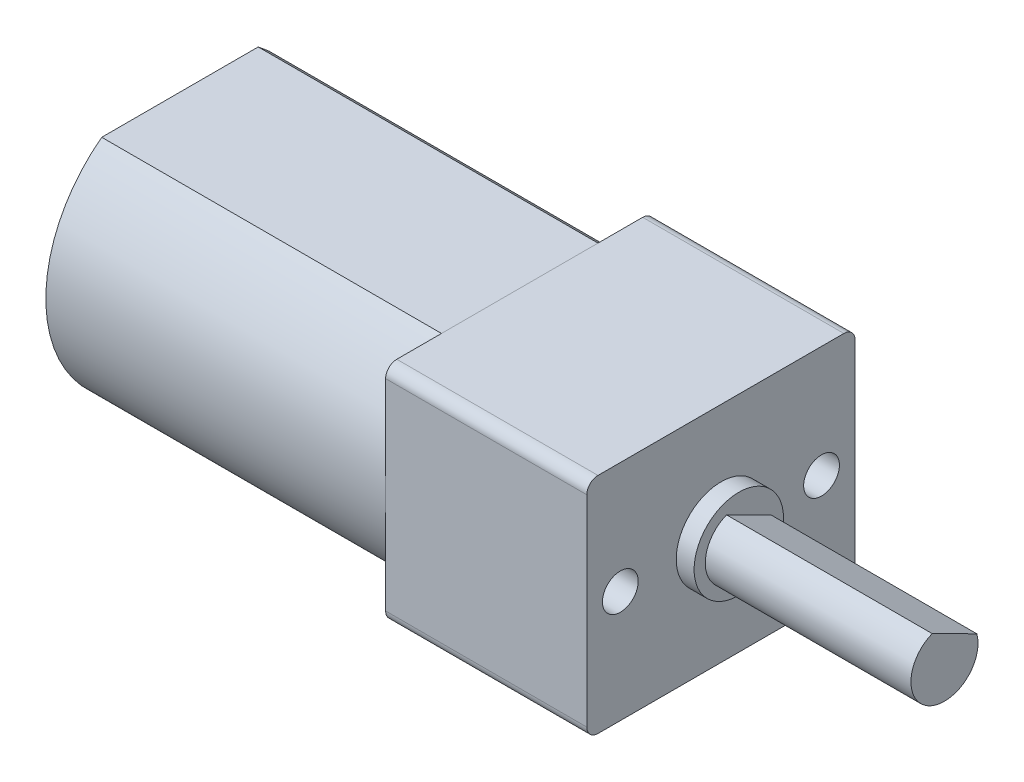
ISO-10303-21;
HEADER;
FILE_DESCRIPTION(('STEP AP214'),'2;1');
FILE_NAME('part.step','',(''),(''),'','','');
FILE_SCHEMA(('AUTOMOTIVE_DESIGN { 1 0 10303 214 1 1 1 1 }'));
ENDSEC;
DATA;
#1=APPLICATION_CONTEXT('core data for automotive mechanical design processes');
#2=APPLICATION_PROTOCOL_DEFINITION('international standard','automotive_design',2000,#1);
#3=PRODUCT_CONTEXT('',#1,'mechanical');
#4=PRODUCT('Part','Part','',(#3));
#5=PRODUCT_RELATED_PRODUCT_CATEGORY('part','',(#4));
#6=PRODUCT_DEFINITION_FORMATION('','',#4);
#7=PRODUCT_DEFINITION_CONTEXT('part definition',#1,'design');
#8=PRODUCT_DEFINITION('design','',#6,#7);
#9=PRODUCT_DEFINITION_SHAPE('','',#8);
#10=(LENGTH_UNIT() NAMED_UNIT(*) SI_UNIT(.MILLI.,.METRE.));
#11=(NAMED_UNIT(*) PLANE_ANGLE_UNIT() SI_UNIT($,.RADIAN.));
#12=(NAMED_UNIT(*) SI_UNIT($,.STERADIAN.) SOLID_ANGLE_UNIT());
#13=UNCERTAINTY_MEASURE_WITH_UNIT(LENGTH_MEASURE(1.E-05),#10,'distance_accuracy_value','');
#14=(GEOMETRIC_REPRESENTATION_CONTEXT(3) GLOBAL_UNCERTAINTY_ASSIGNED_CONTEXT((#13)) GLOBAL_UNIT_ASSIGNED_CONTEXT((#10,
#11,#12)) REPRESENTATION_CONTEXT('',''));
#15=CARTESIAN_POINT('',(0.,0.,0.));
#16=DIRECTION('',(0.,0.,1.));
#17=DIRECTION('',(1.,0.,0.));
#18=AXIS2_PLACEMENT_3D('',#15,#16,#17);
#19=CARTESIAN_POINT('',(34.2,0.893301313072371,-0.44945830069449));
#20=DIRECTION('',(0.,0.893301313072371,-0.449458300694489));
#21=DIRECTION('',(0.,0.449458300694489,0.893301313072371));
#22=AXIS2_PLACEMENT_3D('',#19,#20,#21);
#23=PLANE('',#22);
#24=DIRECTION('',(0.,-0.44945830069449,-0.893301313072371));
#25=VECTOR('',#24,1.);
#26=CARTESIAN_POINT('',(25.,0.893301313072371,-0.44945830069449));
#27=LINE('',#26,#25);
#28=CARTESIAN_POINT('',(25.,1.39581096977458,0.549282929515332));
#29=VERTEX_POINT('',#28);
#30=CARTESIAN_POINT('',(25.,0.390791656370161,-1.44819953090431));
#31=VERTEX_POINT('',#30);
#32=EDGE_CURVE('E72',#29,#31,#27,.T.);
#33=ORIENTED_EDGE('',*,*,#32,.F.);
#34=DIRECTION('',(-1.,0.,0.));
#35=VECTOR('',#34,1.);
#36=CARTESIAN_POINT('',(34.2,1.39581096977458,0.549282929515332));
#37=LINE('',#36,#35);
#38=CARTESIAN_POINT('',(34.2,1.39581096977458,0.549282929515332));
#39=VERTEX_POINT('',#38);
#40=EDGE_CURVE('E12',#39,#29,#37,.T.);
#41=ORIENTED_EDGE('',*,*,#40,.F.);
#42=DIRECTION('',(0.,-0.44945830069449,-0.893301313072371));
#43=VECTOR('',#42,1.);
#44=CARTESIAN_POINT('',(34.2,0.893301313072371,-0.44945830069449));
#45=LINE('',#44,#43);
#46=CARTESIAN_POINT('',(34.2,0.390791656370161,-1.44819953090431));
#47=VERTEX_POINT('',#46);
#48=EDGE_CURVE('E73',#39,#47,#45,.T.);
#49=ORIENTED_EDGE('',*,*,#48,.T.);
#50=DIRECTION('',(-1.,0.,0.));
#51=VECTOR('',#50,1.);
#52=CARTESIAN_POINT('',(34.2,0.390791656370161,-1.44819953090431));
#53=LINE('',#52,#51);
#54=EDGE_CURVE('E52',#47,#31,#53,.T.);
#55=ORIENTED_EDGE('',*,*,#54,.T.);
#56=EDGE_LOOP('',(#33,#41,#49,#55));
#57=FACE_BOUND('',#56,.T.);
#58=ADVANCED_FACE('F44',(#57),#23,.T.);
#59=CARTESIAN_POINT('',(34.2,0.,0.));
#60=DIRECTION('',(-1.,0.,0.));
#61=DIRECTION('',(0.,0.,1.));
#62=AXIS2_PLACEMENT_3D('',#59,#60,#61);
#63=CYLINDRICAL_SURFACE('',#62,1.5);
#64=CARTESIAN_POINT('',(25.,0.,0.));
#65=DIRECTION('',(1.,0.,0.));
#66=DIRECTION('',(0.,0.,-1.));
#67=AXIS2_PLACEMENT_3D('',#64,#65,#66);
#68=CIRCLE('',#67,1.5);
#69=EDGE_CURVE('E74',#29,#31,#68,.T.);
#70=ORIENTED_EDGE('',*,*,#69,.T.);
#71=ORIENTED_EDGE('',*,*,#54,.F.);
#72=CARTESIAN_POINT('',(34.2,0.,0.));
#73=DIRECTION('',(1.,0.,0.));
#74=DIRECTION('',(0.,0.,-1.));
#75=AXIS2_PLACEMENT_3D('',#72,#73,#74);
#76=CIRCLE('',#75,1.5);
#77=EDGE_CURVE('E59',#39,#47,#76,.T.);
#78=ORIENTED_EDGE('',*,*,#77,.F.);
#79=ORIENTED_EDGE('',*,*,#40,.T.);
#80=EDGE_LOOP('',(#70,#71,#78,#79));
#81=FACE_BOUND('',#80,.T.);
#82=ADVANCED_FACE('F75',(#81),#63,.T.);
#83=CARTESIAN_POINT('',(34.2,0.,0.));
#84=DIRECTION('',(1.,0.,0.));
#85=DIRECTION('',(0.,0.,-1.));
#86=AXIS2_PLACEMENT_3D('',#83,#84,#85);
#87=PLANE('',#86);
#88=ORIENTED_EDGE('',*,*,#48,.F.);
#89=ORIENTED_EDGE('',*,*,#77,.T.);
#90=EDGE_LOOP('',(#88,#89));
#91=FACE_BOUND('',#90,.T.);
#92=ADVANCED_FACE('F83',(#91),#87,.T.);
#93=CARTESIAN_POINT('',(25.,0.,0.));
#94=DIRECTION('',(1.,0.,0.));
#95=DIRECTION('',(0.,0.,-1.));
#96=AXIS2_PLACEMENT_3D('',#93,#94,#95);
#97=PLANE('',#96);
#98=ORIENTED_EDGE('',*,*,#32,.T.);
#99=ORIENTED_EDGE('',*,*,#69,.F.);
#100=EDGE_LOOP('',(#98,#99));
#101=FACE_BOUND('',#100,.T.);
#102=ADVANCED_FACE('F78',(#101),#97,.F.);
#103=CLOSED_SHELL('',(#58,#82,#92,#102));
#104=MANIFOLD_SOLID_BREP('B2',#103);
#105=CARTESIAN_POINT('',(24.2,-4.5,5.5));
#106=DIRECTION('',(1.,0.,0.));
#107=DIRECTION('',(0.,0.,-1.));
#108=AXIS2_PLACEMENT_3D('',#105,#106,#107);
#109=PLANE('',#108);
#110=CARTESIAN_POINT('',(24.2,0.,4.5));
#111=DIRECTION('',(1.,0.,0.));
#112=DIRECTION('',(0.,0.,-1.));
#113=AXIS2_PLACEMENT_3D('',#110,#111,#112);
#114=CIRCLE('',#113,0.8);
#115=CARTESIAN_POINT('',(24.2,0.,3.7));
#116=VERTEX_POINT('',#115);
#117=EDGE_CURVE('E282',#116,#116,#114,.T.);
#118=ORIENTED_EDGE('',*,*,#117,.F.);
#119=EDGE_LOOP('',(#118));
#120=FACE_BOUND('',#119,.T.);
#121=CARTESIAN_POINT('',(24.2,0.,-4.5));
#122=DIRECTION('',(1.,0.,0.));
#123=DIRECTION('',(0.,0.,-1.));
#124=AXIS2_PLACEMENT_3D('',#121,#122,#123);
#125=CIRCLE('',#124,0.8);
#126=CARTESIAN_POINT('',(24.2,0.,-5.3));
#127=VERTEX_POINT('',#126);
#128=EDGE_CURVE('E276',#127,#127,#125,.T.);
#129=ORIENTED_EDGE('',*,*,#128,.F.);
#130=EDGE_LOOP('',(#129));
#131=FACE_BOUND('',#130,.T.);
#132=CARTESIAN_POINT('',(24.2,-4.5,5.5));
#133=DIRECTION('',(1.,0.,0.));
#134=DIRECTION('',(0.,0.,-1.));
#135=AXIS2_PLACEMENT_3D('',#132,#133,#134);
#136=CIRCLE('',#135,0.5);
#137=CARTESIAN_POINT('',(24.2,-4.5,6.));
#138=VERTEX_POINT('',#137);
#139=CARTESIAN_POINT('',(24.2,-5.,5.5));
#140=VERTEX_POINT('',#139);
#141=EDGE_CURVE('E237',#138,#140,#136,.T.);
#142=ORIENTED_EDGE('',*,*,#141,.T.);
#143=DIRECTION('',(0.,0.,-1.));
#144=VECTOR('',#143,1.);
#145=CARTESIAN_POINT('',(24.2,-5.,5.5));
#146=LINE('',#145,#144);
#147=CARTESIAN_POINT('',(24.2,-5.,-5.49999999999999));
#148=VERTEX_POINT('',#147);
#149=EDGE_CURVE('E185',#140,#148,#146,.T.);
#150=ORIENTED_EDGE('',*,*,#149,.T.);
#151=CARTESIAN_POINT('',(24.2,-4.5,-5.5));
#152=DIRECTION('',(1.,0.,0.));
#153=DIRECTION('',(0.,0.,-1.));
#154=AXIS2_PLACEMENT_3D('',#151,#152,#153);
#155=CIRCLE('',#154,0.5);
#156=CARTESIAN_POINT('',(24.2,-4.5,-6.));
#157=VERTEX_POINT('',#156);
#158=EDGE_CURVE('E252',#148,#157,#155,.T.);
#159=ORIENTED_EDGE('',*,*,#158,.T.);
#160=DIRECTION('',(0.,1.,0.));
#161=VECTOR('',#160,1.);
#162=CARTESIAN_POINT('',(24.2,4.5,-6.));
#163=LINE('',#162,#161);
#164=CARTESIAN_POINT('',(24.2,4.5,-6.));
#165=VERTEX_POINT('',#164);
#166=EDGE_CURVE('E264',#157,#165,#163,.T.);
#167=ORIENTED_EDGE('',*,*,#166,.T.);
#168=CARTESIAN_POINT('',(24.2,4.5,-5.5));
#169=DIRECTION('',(1.,0.,0.));
#170=DIRECTION('',(0.,0.,1.));
#171=AXIS2_PLACEMENT_3D('',#168,#169,#170);
#172=CIRCLE('',#171,0.5);
#173=CARTESIAN_POINT('',(24.2,5.,-5.49999999999999));
#174=VERTEX_POINT('',#173);
#175=EDGE_CURVE('E204',#165,#174,#172,.T.);
#176=ORIENTED_EDGE('',*,*,#175,.T.);
#177=DIRECTION('',(0.,0.,1.));
#178=VECTOR('',#177,1.);
#179=CARTESIAN_POINT('',(24.2,5.,5.5));
#180=LINE('',#179,#178);
#181=CARTESIAN_POINT('',(24.2,5.,5.5));
#182=VERTEX_POINT('',#181);
#183=EDGE_CURVE('E198',#174,#182,#180,.T.);
#184=ORIENTED_EDGE('',*,*,#183,.T.);
#185=CARTESIAN_POINT('',(24.2,4.5,5.5));
#186=DIRECTION('',(1.,0.,0.));
#187=DIRECTION('',(0.,0.,-1.));
#188=AXIS2_PLACEMENT_3D('',#185,#186,#187);
#189=CIRCLE('',#188,0.5);
#190=CARTESIAN_POINT('',(24.2,4.5,6.));
#191=VERTEX_POINT('',#190);
#192=EDGE_CURVE('E202',#182,#191,#189,.T.);
#193=ORIENTED_EDGE('',*,*,#192,.T.);
#194=DIRECTION('',(0.,-1.,0.));
#195=VECTOR('',#194,1.);
#196=CARTESIAN_POINT('',(24.2,4.5,6.));
#197=LINE('',#196,#195);
#198=EDGE_CURVE('E142',#191,#138,#197,.T.);
#199=ORIENTED_EDGE('',*,*,#198,.T.);
#200=EDGE_LOOP('',(#142,#150,#159,#167,#176,#184,#193,#199));
#201=FACE_BOUND('',#200,.T.);
#202=CARTESIAN_POINT('',(24.2,0.,0.));
#203=DIRECTION('',(1.,0.,0.));
#204=DIRECTION('',(0.,0.,-1.));
#205=AXIS2_PLACEMENT_3D('',#202,#203,#204);
#206=CIRCLE('',#205,2.);
#207=CARTESIAN_POINT('',(24.2,0.,-2.));
#208=VERTEX_POINT('',#207);
#209=EDGE_CURVE('E270',#208,#208,#206,.T.);
#210=ORIENTED_EDGE('',*,*,#209,.F.);
#211=EDGE_LOOP('',(#210));
#212=FACE_BOUND('',#211,.T.);
#213=ADVANCED_FACE('F125',(#120,#131,#201,#212),#109,.T.);
#214=CARTESIAN_POINT('',(24.2,-4.5,5.5));
#215=DIRECTION('',(-1.,0.,0.));
#216=DIRECTION('',(0.,0.,1.));
#217=AXIS2_PLACEMENT_3D('',#214,#215,#216);
#218=CYLINDRICAL_SURFACE('',#217,0.5);
#219=CARTESIAN_POINT('',(15.2,-4.5,5.5));
#220=DIRECTION('',(1.,0.,0.));
#221=DIRECTION('',(0.,0.,-1.));
#222=AXIS2_PLACEMENT_3D('',#219,#220,#221);
#223=CIRCLE('',#222,0.5);
#224=CARTESIAN_POINT('',(15.2,-4.5,6.));
#225=VERTEX_POINT('',#224);
#226=CARTESIAN_POINT('',(15.2,-5.,5.5));
#227=VERTEX_POINT('',#226);
#228=EDGE_CURVE('E222',#225,#227,#223,.T.);
#229=ORIENTED_EDGE('',*,*,#228,.T.);
#230=DIRECTION('',(-1.,0.,0.));
#231=VECTOR('',#230,1.);
#232=CARTESIAN_POINT('',(24.2,-5.,5.5));
#233=LINE('',#232,#231);
#234=EDGE_CURVE('E42',#140,#227,#233,.T.);
#235=ORIENTED_EDGE('',*,*,#234,.F.);
#236=ORIENTED_EDGE('',*,*,#141,.F.);
#237=DIRECTION('',(-1.,0.,0.));
#238=VECTOR('',#237,1.);
#239=CARTESIAN_POINT('',(24.2,-4.5,6.));
#240=LINE('',#239,#238);
#241=EDGE_CURVE('E218',#138,#225,#240,.T.);
#242=ORIENTED_EDGE('',*,*,#241,.T.);
#243=EDGE_LOOP('',(#229,#235,#236,#242));
#244=FACE_BOUND('',#243,.T.);
#245=ADVANCED_FACE('F127',(#244),#218,.T.);
#246=CARTESIAN_POINT('',(24.2,-5.,5.5));
#247=DIRECTION('',(0.,1.,0.));
#248=DIRECTION('',(0.,0.,1.));
#249=AXIS2_PLACEMENT_3D('',#246,#247,#248);
#250=PLANE('',#249);
#251=DIRECTION('',(0.,0.,-1.));
#252=VECTOR('',#251,1.);
#253=CARTESIAN_POINT('',(15.2,-5.,5.5));
#254=LINE('',#253,#252);
#255=CARTESIAN_POINT('',(15.2,-5.,-5.49999999999999));
#256=VERTEX_POINT('',#255);
#257=EDGE_CURVE('E225',#227,#256,#254,.T.);
#258=ORIENTED_EDGE('',*,*,#257,.T.);
#259=DIRECTION('',(-1.,0.,0.));
#260=VECTOR('',#259,1.);
#261=CARTESIAN_POINT('',(24.2,-5.,-5.49999999999999));
#262=LINE('',#261,#260);
#263=EDGE_CURVE('E134',#148,#256,#262,.T.);
#264=ORIENTED_EDGE('',*,*,#263,.F.);
#265=ORIENTED_EDGE('',*,*,#149,.F.);
#266=ORIENTED_EDGE('',*,*,#234,.T.);
#267=EDGE_LOOP('',(#258,#264,#265,#266));
#268=FACE_BOUND('',#267,.T.);
#269=ADVANCED_FACE('F335',(#268),#250,.F.);
#270=CARTESIAN_POINT('',(24.2,-4.5,-5.5));
#271=DIRECTION('',(-1.,0.,0.));
#272=DIRECTION('',(0.,0.,1.));
#273=AXIS2_PLACEMENT_3D('',#270,#271,#272);
#274=CYLINDRICAL_SURFACE('',#273,0.5);
#275=CARTESIAN_POINT('',(15.2,-4.5,-5.5));
#276=DIRECTION('',(1.,0.,0.));
#277=DIRECTION('',(0.,0.,-1.));
#278=AXIS2_PLACEMENT_3D('',#275,#276,#277);
#279=CIRCLE('',#278,0.5);
#280=CARTESIAN_POINT('',(15.2,-4.5,-6.));
#281=VERTEX_POINT('',#280);
#282=EDGE_CURVE('E228',#256,#281,#279,.T.);
#283=ORIENTED_EDGE('',*,*,#282,.T.);
#284=DIRECTION('',(-1.,0.,0.));
#285=VECTOR('',#284,1.);
#286=CARTESIAN_POINT('',(24.2,-4.5,-6.));
#287=LINE('',#286,#285);
#288=EDGE_CURVE('E244',#157,#281,#287,.T.);
#289=ORIENTED_EDGE('',*,*,#288,.F.);
#290=ORIENTED_EDGE('',*,*,#158,.F.);
#291=ORIENTED_EDGE('',*,*,#263,.T.);
#292=EDGE_LOOP('',(#283,#289,#290,#291));
#293=FACE_BOUND('',#292,.T.);
#294=ADVANCED_FACE('F250',(#293),#274,.T.);
#295=CARTESIAN_POINT('',(24.2,4.5,-6.));
#296=DIRECTION('',(0.,0.,1.));
#297=DIRECTION('',(0.,-1.,0.));
#298=AXIS2_PLACEMENT_3D('',#295,#296,#297);
#299=PLANE('',#298);
#300=DIRECTION('',(0.,1.,0.));
#301=VECTOR('',#300,1.);
#302=CARTESIAN_POINT('',(15.2,4.5,-6.));
#303=LINE('',#302,#301);
#304=CARTESIAN_POINT('',(15.2,4.5,-6.));
#305=VERTEX_POINT('',#304);
#306=EDGE_CURVE('E230',#281,#305,#303,.T.);
#307=ORIENTED_EDGE('',*,*,#306,.T.);
#308=DIRECTION('',(-1.,0.,0.));
#309=VECTOR('',#308,1.);
#310=CARTESIAN_POINT('',(24.2,4.5,-6.));
#311=LINE('',#310,#309);
#312=EDGE_CURVE('E241',#165,#305,#311,.T.);
#313=ORIENTED_EDGE('',*,*,#312,.F.);
#314=ORIENTED_EDGE('',*,*,#166,.F.);
#315=ORIENTED_EDGE('',*,*,#288,.T.);
#316=EDGE_LOOP('',(#307,#313,#314,#315));
#317=FACE_BOUND('',#316,.T.);
#318=ADVANCED_FACE('F260',(#317),#299,.F.);
#319=CARTESIAN_POINT('',(24.2,4.5,-5.5));
#320=DIRECTION('',(-1.,0.,0.));
#321=DIRECTION('',(0.,0.,1.));
#322=AXIS2_PLACEMENT_3D('',#319,#320,#321);
#323=CYLINDRICAL_SURFACE('',#322,0.5);
#324=CARTESIAN_POINT('',(15.2,4.5,-5.5));
#325=DIRECTION('',(1.,0.,0.));
#326=DIRECTION('',(0.,0.,1.));
#327=AXIS2_PLACEMENT_3D('',#324,#325,#326);
#328=CIRCLE('',#327,0.5);
#329=CARTESIAN_POINT('',(15.2,5.,-5.49999999999999));
#330=VERTEX_POINT('',#329);
#331=EDGE_CURVE('E232',#305,#330,#328,.T.);
#332=ORIENTED_EDGE('',*,*,#331,.T.);
#333=DIRECTION('',(-1.,0.,0.));
#334=VECTOR('',#333,1.);
#335=CARTESIAN_POINT('',(24.2,5.,-5.49999999999999));
#336=LINE('',#335,#334);
#337=EDGE_CURVE('E213',#174,#330,#336,.T.);
#338=ORIENTED_EDGE('',*,*,#337,.F.);
#339=ORIENTED_EDGE('',*,*,#175,.F.);
#340=ORIENTED_EDGE('',*,*,#312,.T.);
#341=EDGE_LOOP('',(#332,#338,#339,#340));
#342=FACE_BOUND('',#341,.T.);
#343=ADVANCED_FACE('F263',(#342),#323,.T.);
#344=CARTESIAN_POINT('',(24.2,5.,5.5));
#345=DIRECTION('',(0.,-1.,0.));
#346=DIRECTION('',(0.,0.,-1.));
#347=AXIS2_PLACEMENT_3D('',#344,#345,#346);
#348=PLANE('',#347);
#349=DIRECTION('',(0.,0.,1.));
#350=VECTOR('',#349,1.);
#351=CARTESIAN_POINT('',(15.2,5.,5.5));
#352=LINE('',#351,#350);
#353=CARTESIAN_POINT('',(15.2,5.,5.5));
#354=VERTEX_POINT('',#353);
#355=EDGE_CURVE('E212',#330,#354,#352,.T.);
#356=ORIENTED_EDGE('',*,*,#355,.T.);
#357=DIRECTION('',(-1.,0.,0.));
#358=VECTOR('',#357,1.);
#359=CARTESIAN_POINT('',(24.2,5.,5.5));
#360=LINE('',#359,#358);
#361=EDGE_CURVE('E209',#182,#354,#360,.T.);
#362=ORIENTED_EDGE('',*,*,#361,.F.);
#363=ORIENTED_EDGE('',*,*,#183,.F.);
#364=ORIENTED_EDGE('',*,*,#337,.T.);
#365=EDGE_LOOP('',(#356,#362,#363,#364));
#366=FACE_BOUND('',#365,.T.);
#367=ADVANCED_FACE('F210',(#366),#348,.F.);
#368=CARTESIAN_POINT('',(24.2,4.5,5.5));
#369=DIRECTION('',(-1.,0.,0.));
#370=DIRECTION('',(0.,0.,1.));
#371=AXIS2_PLACEMENT_3D('',#368,#369,#370);
#372=CYLINDRICAL_SURFACE('',#371,0.5);
#373=CARTESIAN_POINT('',(15.2,4.5,5.5));
#374=DIRECTION('',(1.,0.,0.));
#375=DIRECTION('',(0.,0.,-1.));
#376=AXIS2_PLACEMENT_3D('',#373,#374,#375);
#377=CIRCLE('',#376,0.5);
#378=CARTESIAN_POINT('',(15.2,4.5,6.));
#379=VERTEX_POINT('',#378);
#380=EDGE_CURVE('E171',#354,#379,#377,.T.);
#381=ORIENTED_EDGE('',*,*,#380,.T.);
#382=DIRECTION('',(-1.,0.,0.));
#383=VECTOR('',#382,1.);
#384=CARTESIAN_POINT('',(24.2,4.5,6.));
#385=LINE('',#384,#383);
#386=EDGE_CURVE('E214',#191,#379,#385,.T.);
#387=ORIENTED_EDGE('',*,*,#386,.F.);
#388=ORIENTED_EDGE('',*,*,#192,.F.);
#389=ORIENTED_EDGE('',*,*,#361,.T.);
#390=EDGE_LOOP('',(#381,#387,#388,#389));
#391=FACE_BOUND('',#390,.T.);
#392=ADVANCED_FACE('F216',(#391),#372,.T.);
#393=CARTESIAN_POINT('',(24.2,4.5,6.));
#394=DIRECTION('',(0.,0.,-1.));
#395=DIRECTION('',(0.,1.,0.));
#396=AXIS2_PLACEMENT_3D('',#393,#394,#395);
#397=PLANE('',#396);
#398=DIRECTION('',(0.,-1.,0.));
#399=VECTOR('',#398,1.);
#400=CARTESIAN_POINT('',(15.2,4.5,6.));
#401=LINE('',#400,#399);
#402=EDGE_CURVE('E177',#379,#225,#401,.T.);
#403=ORIENTED_EDGE('',*,*,#402,.T.);
#404=ORIENTED_EDGE('',*,*,#241,.F.);
#405=ORIENTED_EDGE('',*,*,#198,.F.);
#406=ORIENTED_EDGE('',*,*,#386,.T.);
#407=EDGE_LOOP('',(#403,#404,#405,#406));
#408=FACE_BOUND('',#407,.T.);
#409=ADVANCED_FACE('F323',(#408),#397,.F.);
#410=CARTESIAN_POINT('',(15.2,-4.5,5.5));
#411=DIRECTION('',(1.,0.,0.));
#412=DIRECTION('',(0.,0.,-1.));
#413=AXIS2_PLACEMENT_3D('',#410,#411,#412);
#414=PLANE('',#413);
#415=ORIENTED_EDGE('',*,*,#228,.F.);
#416=ORIENTED_EDGE('',*,*,#402,.F.);
#417=ORIENTED_EDGE('',*,*,#380,.F.);
#418=ORIENTED_EDGE('',*,*,#355,.F.);
#419=ORIENTED_EDGE('',*,*,#331,.F.);
#420=ORIENTED_EDGE('',*,*,#306,.F.);
#421=ORIENTED_EDGE('',*,*,#282,.F.);
#422=ORIENTED_EDGE('',*,*,#257,.F.);
#423=EDGE_LOOP('',(#415,#416,#417,#418,#419,#420,#421,#422));
#424=FACE_BOUND('',#423,.T.);
#425=ADVANCED_FACE('F256',(#424),#414,.F.);
#426=CARTESIAN_POINT('',(25.,0.,0.));
#427=DIRECTION('',(-1.,0.,0.));
#428=DIRECTION('',(0.,0.,1.));
#429=AXIS2_PLACEMENT_3D('',#426,#427,#428);
#430=CYLINDRICAL_SURFACE('',#429,2.);
#431=CARTESIAN_POINT('',(25.,0.,0.));
#432=DIRECTION('',(1.,0.,0.));
#433=DIRECTION('',(0.,0.,-1.));
#434=AXIS2_PLACEMENT_3D('',#431,#432,#433);
#435=CIRCLE('',#434,2.);
#436=CARTESIAN_POINT('',(25.,0.,-2.));
#437=VERTEX_POINT('',#436);
#438=EDGE_CURVE('E226',#437,#437,#435,.T.);
#439=ORIENTED_EDGE('',*,*,#438,.F.);
#440=EDGE_LOOP('',(#439));
#441=FACE_BOUND('',#440,.T.);
#442=ORIENTED_EDGE('',*,*,#209,.T.);
#443=EDGE_LOOP('',(#442));
#444=FACE_BOUND('',#443,.T.);
#445=ADVANCED_FACE('F313',(#441,#444),#430,.T.);
#446=CARTESIAN_POINT('',(25.,0.,0.));
#447=DIRECTION('',(1.,0.,0.));
#448=DIRECTION('',(0.,0.,-1.));
#449=AXIS2_PLACEMENT_3D('',#446,#447,#448);
#450=PLANE('',#449);
#451=ORIENTED_EDGE('',*,*,#438,.T.);
#452=EDGE_LOOP('',(#451));
#453=FACE_BOUND('',#452,.T.);
#454=ADVANCED_FACE('F304',(#453),#450,.T.);
#455=CARTESIAN_POINT('',(22.2,0.,-4.5));
#456=DIRECTION('',(1.,0.,0.));
#457=DIRECTION('',(0.,0.,-1.));
#458=AXIS2_PLACEMENT_3D('',#455,#456,#457);
#459=CYLINDRICAL_SURFACE('',#458,0.8);
#460=CARTESIAN_POINT('',(22.2,0.,-4.5));
#461=DIRECTION('',(1.,0.,0.));
#462=DIRECTION('',(0.,0.,-1.));
#463=AXIS2_PLACEMENT_3D('',#460,#461,#462);
#464=CIRCLE('',#463,0.8);
#465=CARTESIAN_POINT('',(22.2,0.,-5.3));
#466=VERTEX_POINT('',#465);
#467=EDGE_CURVE('E273',#466,#466,#464,.T.);
#468=ORIENTED_EDGE('',*,*,#467,.F.);
#469=EDGE_LOOP('',(#468));
#470=FACE_BOUND('',#469,.T.);
#471=ORIENTED_EDGE('',*,*,#128,.T.);
#472=EDGE_LOOP('',(#471));
#473=FACE_BOUND('',#472,.T.);
#474=ADVANCED_FACE('F302',(#470,#473),#459,.F.);
#475=CARTESIAN_POINT('',(22.2,0.,-4.5));
#476=DIRECTION('',(1.,0.,0.));
#477=DIRECTION('',(0.,0.,-1.));
#478=AXIS2_PLACEMENT_3D('',#475,#476,#477);
#479=PLANE('',#478);
#480=ORIENTED_EDGE('',*,*,#467,.T.);
#481=EDGE_LOOP('',(#480));
#482=FACE_BOUND('',#481,.T.);
#483=ADVANCED_FACE('F293',(#482),#479,.T.);
#484=CARTESIAN_POINT('',(22.2,0.,4.5));
#485=DIRECTION('',(1.,0.,0.));
#486=DIRECTION('',(0.,0.,-1.));
#487=AXIS2_PLACEMENT_3D('',#484,#485,#486);
#488=CYLINDRICAL_SURFACE('',#487,0.8);
#489=CARTESIAN_POINT('',(22.2,0.,4.5));
#490=DIRECTION('',(1.,0.,0.));
#491=DIRECTION('',(0.,0.,-1.));
#492=AXIS2_PLACEMENT_3D('',#489,#490,#491);
#493=CIRCLE('',#492,0.8);
#494=CARTESIAN_POINT('',(22.2,0.,3.7));
#495=VERTEX_POINT('',#494);
#496=EDGE_CURVE('E279',#495,#495,#493,.T.);
#497=ORIENTED_EDGE('',*,*,#496,.F.);
#498=EDGE_LOOP('',(#497));
#499=FACE_BOUND('',#498,.T.);
#500=ORIENTED_EDGE('',*,*,#117,.T.);
#501=EDGE_LOOP('',(#500));
#502=FACE_BOUND('',#501,.T.);
#503=ADVANCED_FACE('F290',(#499,#502),#488,.F.);
#504=CARTESIAN_POINT('',(22.2,0.,4.5));
#505=DIRECTION('',(1.,0.,0.));
#506=DIRECTION('',(0.,0.,-1.));
#507=AXIS2_PLACEMENT_3D('',#504,#505,#506);
#508=PLANE('',#507);
#509=ORIENTED_EDGE('',*,*,#496,.T.);
#510=EDGE_LOOP('',(#509));
#511=FACE_BOUND('',#510,.T.);
#512=ADVANCED_FACE('F288',(#511),#508,.T.);
#513=CLOSED_SHELL('',(#213,#245,#269,#294,#318,#343,#367,#392,#409,#425,#445,#454,#474,#483,
#503,#512));
#514=MANIFOLD_SOLID_BREP('B6',#513);
#515=CARTESIAN_POINT('',(15.2,0.,-0.250000000000001));
#516=DIRECTION('',(-1.,0.,0.));
#517=DIRECTION('',(0.,0.,1.));
#518=AXIS2_PLACEMENT_3D('',#515,#516,#517);
#519=CYLINDRICAL_SURFACE('',#518,6.25);
#520=CARTESIAN_POINT('',(0.,0.,-0.250000000000001));
#521=DIRECTION('',(1.,0.,0.));
#522=DIRECTION('',(0.,0.,-1.));
#523=AXIS2_PLACEMENT_3D('',#520,#521,#522);
#524=CIRCLE('',#523,6.25);
#525=CARTESIAN_POINT('',(0.,5.,3.5));
#526=VERTEX_POINT('',#525);
#527=CARTESIAN_POINT('',(0.,-5.,3.5));
#528=VERTEX_POINT('',#527);
#529=EDGE_CURVE('E506',#526,#528,#524,.T.);
#530=ORIENTED_EDGE('',*,*,#529,.T.);
#531=DIRECTION('',(-1.,0.,0.));
#532=VECTOR('',#531,1.);
#533=CARTESIAN_POINT('',(15.2,-5.,3.5));
#534=LINE('',#533,#532);
#535=CARTESIAN_POINT('',(15.2,-5.,3.5));
#536=VERTEX_POINT('',#535);
#537=EDGE_CURVE('E123',#536,#528,#534,.T.);
#538=ORIENTED_EDGE('',*,*,#537,.F.);
#539=CARTESIAN_POINT('',(15.2,0.,-0.250000000000001));
#540=DIRECTION('',(1.,0.,0.));
#541=DIRECTION('',(0.,0.,-1.));
#542=AXIS2_PLACEMENT_3D('',#539,#540,#541);
#543=CIRCLE('',#542,6.25);
#544=CARTESIAN_POINT('',(15.2,5.,3.5));
#545=VERTEX_POINT('',#544);
#546=EDGE_CURVE('E492',#545,#536,#543,.T.);
#547=ORIENTED_EDGE('',*,*,#546,.F.);
#548=DIRECTION('',(-1.,0.,0.));
#549=VECTOR('',#548,1.);
#550=CARTESIAN_POINT('',(15.2,5.,3.5));
#551=LINE('',#550,#549);
#552=EDGE_CURVE('E459',#545,#526,#551,.T.);
#553=ORIENTED_EDGE('',*,*,#552,.T.);
#554=EDGE_LOOP('',(#530,#538,#547,#553));
#555=FACE_BOUND('',#554,.T.);
#556=ADVANCED_FACE('F443',(#555),#519,.T.);
#557=CARTESIAN_POINT('',(15.2,-5.,0.));
#558=DIRECTION('',(0.,1.,0.));
#559=DIRECTION('',(0.,0.,1.));
#560=AXIS2_PLACEMENT_3D('',#557,#558,#559);
#561=PLANE('',#560);
#562=DIRECTION('',(0.,0.,-1.));
#563=VECTOR('',#562,1.);
#564=CARTESIAN_POINT('',(0.,-5.,0.));
#565=LINE('',#564,#563);
#566=CARTESIAN_POINT('',(0.,-5.,-3.5));
#567=VERTEX_POINT('',#566);
#568=EDGE_CURVE('E497',#528,#567,#565,.T.);
#569=ORIENTED_EDGE('',*,*,#568,.T.);
#570=DIRECTION('',(-1.,0.,0.));
#571=VECTOR('',#570,1.);
#572=CARTESIAN_POINT('',(15.2,-5.,-3.5));
#573=LINE('',#572,#571);
#574=CARTESIAN_POINT('',(15.2,-5.,-3.5));
#575=VERTEX_POINT('',#574);
#576=EDGE_CURVE('E451',#575,#567,#573,.T.);
#577=ORIENTED_EDGE('',*,*,#576,.F.);
#578=DIRECTION('',(0.,0.,-1.));
#579=VECTOR('',#578,1.);
#580=CARTESIAN_POINT('',(15.2,-5.,0.));
#581=LINE('',#580,#579);
#582=EDGE_CURVE('E484',#536,#575,#581,.T.);
#583=ORIENTED_EDGE('',*,*,#582,.F.);
#584=ORIENTED_EDGE('',*,*,#537,.T.);
#585=EDGE_LOOP('',(#569,#577,#583,#584));
#586=FACE_BOUND('',#585,.T.);
#587=ADVANCED_FACE('F496',(#586),#561,.F.);
#588=CARTESIAN_POINT('',(15.2,0.,0.250000000000001));
#589=DIRECTION('',(-1.,0.,0.));
#590=DIRECTION('',(0.,0.,1.));
#591=AXIS2_PLACEMENT_3D('',#588,#589,#590);
#592=CYLINDRICAL_SURFACE('',#591,6.25);
#593=CARTESIAN_POINT('',(0.,0.,0.250000000000001));
#594=DIRECTION('',(1.,0.,0.));
#595=DIRECTION('',(0.,0.,-1.));
#596=AXIS2_PLACEMENT_3D('',#593,#594,#595);
#597=CIRCLE('',#596,6.25);
#598=CARTESIAN_POINT('',(0.,5.,-3.5));
#599=VERTEX_POINT('',#598);
#600=EDGE_CURVE('E509',#599,#567,#597,.F.);
#601=ORIENTED_EDGE('',*,*,#600,.F.);
#602=DIRECTION('',(-1.,0.,0.));
#603=VECTOR('',#602,1.);
#604=CARTESIAN_POINT('',(15.2,5.,-3.5));
#605=LINE('',#604,#603);
#606=CARTESIAN_POINT('',(15.2,5.,-3.5));
#607=VERTEX_POINT('',#606);
#608=EDGE_CURVE('E473',#607,#599,#605,.T.);
#609=ORIENTED_EDGE('',*,*,#608,.F.);
#610=CARTESIAN_POINT('',(15.2,0.,0.250000000000001));
#611=DIRECTION('',(1.,0.,0.));
#612=DIRECTION('',(0.,0.,-1.));
#613=AXIS2_PLACEMENT_3D('',#610,#611,#612);
#614=CIRCLE('',#613,6.25);
#615=EDGE_CURVE('E491',#607,#575,#614,.F.);
#616=ORIENTED_EDGE('',*,*,#615,.T.);
#617=ORIENTED_EDGE('',*,*,#576,.T.);
#618=EDGE_LOOP('',(#601,#609,#616,#617));
#619=FACE_BOUND('',#618,.T.);
#620=ADVANCED_FACE('F500',(#619),#592,.T.);
#621=CARTESIAN_POINT('',(15.2,5.,0.));
#622=DIRECTION('',(0.,1.,0.));
#623=DIRECTION('',(0.,0.,1.));
#624=AXIS2_PLACEMENT_3D('',#621,#622,#623);
#625=PLANE('',#624);
#626=DIRECTION('',(0.,0.,-1.));
#627=VECTOR('',#626,1.);
#628=CARTESIAN_POINT('',(0.,5.,0.));
#629=LINE('',#628,#627);
#630=EDGE_CURVE('E511',#526,#599,#629,.T.);
#631=ORIENTED_EDGE('',*,*,#630,.F.);
#632=ORIENTED_EDGE('',*,*,#552,.F.);
#633=DIRECTION('',(0.,0.,-1.));
#634=VECTOR('',#633,1.);
#635=CARTESIAN_POINT('',(15.2,5.,0.));
#636=LINE('',#635,#634);
#637=EDGE_CURVE('E501',#545,#607,#636,.T.);
#638=ORIENTED_EDGE('',*,*,#637,.T.);
#639=ORIENTED_EDGE('',*,*,#608,.T.);
#640=EDGE_LOOP('',(#631,#632,#638,#639));
#641=FACE_BOUND('',#640,.T.);
#642=ADVANCED_FACE('F517',(#641),#625,.T.);
#643=CARTESIAN_POINT('',(15.2,0.,0.));
#644=DIRECTION('',(1.,0.,0.));
#645=DIRECTION('',(0.,0.,-1.));
#646=AXIS2_PLACEMENT_3D('',#643,#644,#645);
#647=PLANE('',#646);
#648=ORIENTED_EDGE('',*,*,#546,.T.);
#649=ORIENTED_EDGE('',*,*,#582,.T.);
#650=ORIENTED_EDGE('',*,*,#615,.F.);
#651=ORIENTED_EDGE('',*,*,#637,.F.);
#652=EDGE_LOOP('',(#648,#649,#650,#651));
#653=FACE_BOUND('',#652,.T.);
#654=ADVANCED_FACE('F488',(#653),#647,.T.);
#655=CARTESIAN_POINT('',(0.,0.,0.));
#656=DIRECTION('',(1.,0.,0.));
#657=DIRECTION('',(0.,0.,-1.));
#658=AXIS2_PLACEMENT_3D('',#655,#656,#657);
#659=PLANE('',#658);
#660=ORIENTED_EDGE('',*,*,#529,.F.);
#661=ORIENTED_EDGE('',*,*,#630,.T.);
#662=ORIENTED_EDGE('',*,*,#600,.T.);
#663=ORIENTED_EDGE('',*,*,#568,.F.);
#664=EDGE_LOOP('',(#660,#661,#662,#663));
#665=FACE_BOUND('',#664,.T.);
#666=ADVANCED_FACE('F516',(#665),#659,.F.);
#667=CLOSED_SHELL('',(#556,#587,#620,#642,#654,#666));
#668=MANIFOLD_SOLID_BREP('B36',#667);
#669=ADVANCED_BREP_SHAPE_REPRESENTATION('',(#18,#104,#514,#668),#14);
#670=SHAPE_DEFINITION_REPRESENTATION(#9,#669);
ENDSEC;
END-ISO-10303-21;
